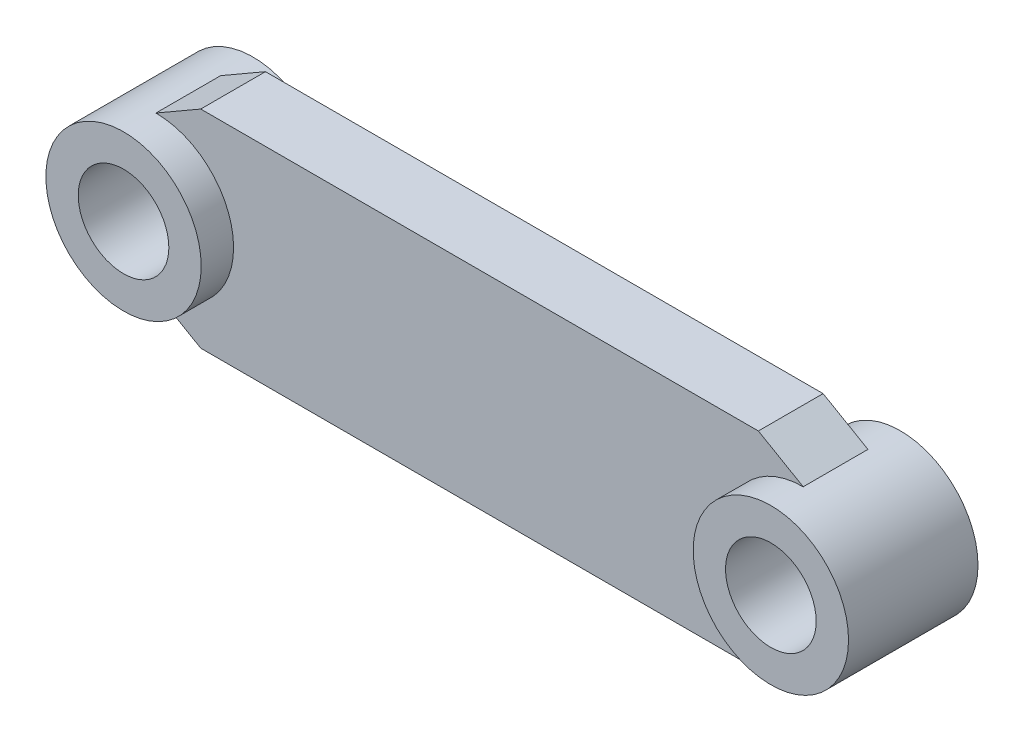
ISO-10303-21;
HEADER;
FILE_DESCRIPTION(('STEP AP214'),'2;1');
FILE_NAME('part.step','',(''),(''),'','','');
FILE_SCHEMA(('AUTOMOTIVE_DESIGN { 1 0 10303 214 1 1 1 1 }'));
ENDSEC;
DATA;
#1=APPLICATION_CONTEXT('core data for automotive mechanical design processes');
#2=APPLICATION_PROTOCOL_DEFINITION('international standard','automotive_design',2000,#1);
#3=PRODUCT_CONTEXT('',#1,'mechanical');
#4=PRODUCT('Part','Part','',(#3));
#5=PRODUCT_RELATED_PRODUCT_CATEGORY('part','',(#4));
#6=PRODUCT_DEFINITION_FORMATION('','',#4);
#7=PRODUCT_DEFINITION_CONTEXT('part definition',#1,'design');
#8=PRODUCT_DEFINITION('design','',#6,#7);
#9=PRODUCT_DEFINITION_SHAPE('','',#8);
#10=(LENGTH_UNIT() NAMED_UNIT(*) SI_UNIT(.MILLI.,.METRE.));
#11=(NAMED_UNIT(*) PLANE_ANGLE_UNIT() SI_UNIT($,.RADIAN.));
#12=(NAMED_UNIT(*) SI_UNIT($,.STERADIAN.) SOLID_ANGLE_UNIT());
#13=UNCERTAINTY_MEASURE_WITH_UNIT(LENGTH_MEASURE(1.E-05),#10,'distance_accuracy_value','');
#14=(GEOMETRIC_REPRESENTATION_CONTEXT(3) GLOBAL_UNCERTAINTY_ASSIGNED_CONTEXT((#13)) GLOBAL_UNIT_ASSIGNED_CONTEXT((#10,
#11,#12)) REPRESENTATION_CONTEXT('',''));
#15=CARTESIAN_POINT('',(0.,0.,0.));
#16=DIRECTION('',(0.,0.,1.));
#17=DIRECTION('',(1.,0.,0.));
#18=AXIS2_PLACEMENT_3D('',#15,#16,#17);
#19=CARTESIAN_POINT('',(0.,0.,2.5));
#20=DIRECTION('',(0.,0.,1.));
#21=DIRECTION('',(1.,0.,0.));
#22=AXIS2_PLACEMENT_3D('',#19,#20,#21);
#23=PLANE('',#22);
#24=DIRECTION('',(-0.866025403784443,-0.499999999999993,0.));
#25=VECTOR('',#24,1.);
#26=CARTESIAN_POINT('',(15.098076211353,-26.1506350946108,2.5));
#27=LINE('',#26,#25);
#28=CARTESIAN_POINT('',(50.,-6.,2.5));
#29=VERTEX_POINT('',#28);
#30=CARTESIAN_POINT('',(46.5358983848622,-8.,2.5));
#31=VERTEX_POINT('',#30);
#32=EDGE_CURVE('E149',#29,#31,#27,.T.);
#33=ORIENTED_EDGE('',*,*,#32,.F.);
#34=CARTESIAN_POINT('',(50.,0.,2.5));
#35=DIRECTION('',(0.,0.,1.));
#36=DIRECTION('',(1.,0.,0.));
#37=AXIS2_PLACEMENT_3D('',#34,#35,#36);
#38=CIRCLE('',#37,6.);
#39=CARTESIAN_POINT('',(50.,6.,2.5));
#40=VERTEX_POINT('',#39);
#41=EDGE_CURVE('E91',#29,#40,#38,.F.);
#42=ORIENTED_EDGE('',*,*,#41,.T.);
#43=DIRECTION('',(-0.866025403784443,0.499999999999993,0.));
#44=VECTOR('',#43,1.);
#45=CARTESIAN_POINT('',(15.098076211353,26.1506350946108,2.5));
#46=LINE('',#45,#44);
#47=CARTESIAN_POINT('',(46.5358983848622,8.,2.5));
#48=VERTEX_POINT('',#47);
#49=EDGE_CURVE('E179',#40,#48,#46,.T.);
#50=ORIENTED_EDGE('',*,*,#49,.T.);
#51=DIRECTION('',(-1.,0.,0.));
#52=VECTOR('',#51,1.);
#53=CARTESIAN_POINT('',(0.,7.99999999999999,2.5));
#54=LINE('',#53,#52);
#55=CARTESIAN_POINT('',(3.46410161513773,7.99999999999999,2.5));
#56=VERTEX_POINT('',#55);
#57=EDGE_CURVE('E131',#48,#56,#54,.T.);
#58=ORIENTED_EDGE('',*,*,#57,.T.);
#59=DIRECTION('',(0.866025403784438,0.500000000000002,0.));
#60=VECTOR('',#59,1.);
#61=CARTESIAN_POINT('',(-2.59807621135332,4.49999999999999,2.5));
#62=LINE('',#61,#60);
#63=CARTESIAN_POINT('',(0.,6.,2.5));
#64=VERTEX_POINT('',#63);
#65=EDGE_CURVE('E111',#64,#56,#62,.T.);
#66=ORIENTED_EDGE('',*,*,#65,.F.);
#67=CARTESIAN_POINT('',(0.,0.,2.5));
#68=DIRECTION('',(0.,0.,1.));
#69=DIRECTION('',(1.,0.,0.));
#70=AXIS2_PLACEMENT_3D('',#67,#68,#69);
#71=CIRCLE('',#70,6.);
#72=CARTESIAN_POINT('',(0.,-6.,2.5));
#73=VERTEX_POINT('',#72);
#74=EDGE_CURVE('E104',#64,#73,#71,.F.);
#75=ORIENTED_EDGE('',*,*,#74,.T.);
#76=DIRECTION('',(0.866025403784438,-0.500000000000002,0.));
#77=VECTOR('',#76,1.);
#78=CARTESIAN_POINT('',(-2.59807621135332,-4.49999999999999,2.5));
#79=LINE('',#78,#77);
#80=CARTESIAN_POINT('',(3.46410161513773,-7.99999999999999,2.5));
#81=VERTEX_POINT('',#80);
#82=EDGE_CURVE('E109',#73,#81,#79,.T.);
#83=ORIENTED_EDGE('',*,*,#82,.T.);
#84=DIRECTION('',(-1.,0.,0.));
#85=VECTOR('',#84,1.);
#86=CARTESIAN_POINT('',(0.,-7.99999999999999,2.5));
#87=LINE('',#86,#85);
#88=EDGE_CURVE('E128',#31,#81,#87,.T.);
#89=ORIENTED_EDGE('',*,*,#88,.F.);
#90=EDGE_LOOP('',(#33,#42,#50,#58,#66,#75,#83,#89));
#91=FACE_BOUND('',#90,.T.);
#92=ADVANCED_FACE('F39',(#91),#23,.T.);
#93=CARTESIAN_POINT('',(0.,0.,-2.5));
#94=DIRECTION('',(0.,0.,1.));
#95=DIRECTION('',(1.,0.,0.));
#96=AXIS2_PLACEMENT_3D('',#93,#94,#95);
#97=PLANE('',#96);
#98=CARTESIAN_POINT('',(50.,0.,-2.5));
#99=DIRECTION('',(0.,0.,1.));
#100=DIRECTION('',(1.,0.,0.));
#101=AXIS2_PLACEMENT_3D('',#98,#99,#100);
#102=CIRCLE('',#101,6.);
#103=CARTESIAN_POINT('',(50.,-6.,-2.5));
#104=VERTEX_POINT('',#103);
#105=CARTESIAN_POINT('',(50.,6.,-2.5));
#106=VERTEX_POINT('',#105);
#107=EDGE_CURVE('E11',#104,#106,#102,.F.);
#108=ORIENTED_EDGE('',*,*,#107,.F.);
#109=DIRECTION('',(-0.866025403784443,-0.499999999999993,0.));
#110=VECTOR('',#109,1.);
#111=CARTESIAN_POINT('',(15.098076211353,-26.1506350946108,-2.5));
#112=LINE('',#111,#110);
#113=CARTESIAN_POINT('',(46.5358983848622,-8.,-2.5));
#114=VERTEX_POINT('',#113);
#115=EDGE_CURVE('E115',#104,#114,#112,.T.);
#116=ORIENTED_EDGE('',*,*,#115,.T.);
#117=DIRECTION('',(-1.,0.,0.));
#118=VECTOR('',#117,1.);
#119=CARTESIAN_POINT('',(0.,-7.99999999999999,-2.5));
#120=LINE('',#119,#118);
#121=CARTESIAN_POINT('',(3.46410161513773,-7.99999999999999,-2.5));
#122=VERTEX_POINT('',#121);
#123=EDGE_CURVE('E146',#114,#122,#120,.T.);
#124=ORIENTED_EDGE('',*,*,#123,.T.);
#125=DIRECTION('',(0.866025403784438,-0.500000000000002,0.));
#126=VECTOR('',#125,1.);
#127=CARTESIAN_POINT('',(-2.59807621135332,-4.49999999999999,-2.5));
#128=LINE('',#127,#126);
#129=CARTESIAN_POINT('',(0.,-6.,-2.5));
#130=VERTEX_POINT('',#129);
#131=EDGE_CURVE('E144',#130,#122,#128,.T.);
#132=ORIENTED_EDGE('',*,*,#131,.F.);
#133=CARTESIAN_POINT('',(0.,0.,-2.5));
#134=DIRECTION('',(0.,0.,1.));
#135=DIRECTION('',(1.,0.,0.));
#136=AXIS2_PLACEMENT_3D('',#133,#134,#135);
#137=CIRCLE('',#136,6.);
#138=CARTESIAN_POINT('',(0.,6.,-2.5));
#139=VERTEX_POINT('',#138);
#140=EDGE_CURVE('E48',#139,#130,#137,.F.);
#141=ORIENTED_EDGE('',*,*,#140,.F.);
#142=DIRECTION('',(0.866025403784438,0.500000000000002,0.));
#143=VECTOR('',#142,1.);
#144=CARTESIAN_POINT('',(-2.59807621135332,4.49999999999999,-2.5));
#145=LINE('',#144,#143);
#146=CARTESIAN_POINT('',(3.46410161513773,7.99999999999999,-2.5));
#147=VERTEX_POINT('',#146);
#148=EDGE_CURVE('E141',#139,#147,#145,.T.);
#149=ORIENTED_EDGE('',*,*,#148,.T.);
#150=DIRECTION('',(-1.,0.,0.));
#151=VECTOR('',#150,1.);
#152=CARTESIAN_POINT('',(0.,7.99999999999999,-2.5));
#153=LINE('',#152,#151);
#154=CARTESIAN_POINT('',(46.5358983848622,8.,-2.5));
#155=VERTEX_POINT('',#154);
#156=EDGE_CURVE('E138',#155,#147,#153,.T.);
#157=ORIENTED_EDGE('',*,*,#156,.F.);
#158=DIRECTION('',(-0.866025403784443,0.499999999999993,0.));
#159=VECTOR('',#158,1.);
#160=CARTESIAN_POINT('',(15.098076211353,26.1506350946108,-2.5));
#161=LINE('',#160,#159);
#162=EDGE_CURVE('E136',#106,#155,#161,.T.);
#163=ORIENTED_EDGE('',*,*,#162,.F.);
#164=EDGE_LOOP('',(#108,#116,#124,#132,#141,#149,#157,#163));
#165=FACE_BOUND('',#164,.T.);
#166=ADVANCED_FACE('F169',(#165),#97,.F.);
#167=CARTESIAN_POINT('',(15.098076211353,-26.1506350946108,2.5));
#168=DIRECTION('',(0.499999999999993,-0.866025403784442,0.));
#169=DIRECTION('',(0.866025403784442,0.499999999999993,0.));
#170=AXIS2_PLACEMENT_3D('',#167,#168,#169);
#171=PLANE('',#170);
#172=ORIENTED_EDGE('',*,*,#115,.F.);
#173=DIRECTION('',(0.,0.,-1.));
#174=VECTOR('',#173,1.);
#175=CARTESIAN_POINT('',(50.,-6.,2.5));
#176=LINE('',#175,#174);
#177=EDGE_CURVE('E160',#29,#104,#176,.T.);
#178=ORIENTED_EDGE('',*,*,#177,.F.);
#179=ORIENTED_EDGE('',*,*,#32,.T.);
#180=DIRECTION('',(0.,0.,-1.));
#181=VECTOR('',#180,1.);
#182=CARTESIAN_POINT('',(46.5358983848622,-8.,2.5));
#183=LINE('',#182,#181);
#184=EDGE_CURVE('E56',#31,#114,#183,.T.);
#185=ORIENTED_EDGE('',*,*,#184,.T.);
#186=EDGE_LOOP('',(#172,#178,#179,#185));
#187=FACE_BOUND('',#186,.T.);
#188=ADVANCED_FACE('F41',(#187),#171,.T.);
#189=CARTESIAN_POINT('',(50.,0.,2.5));
#190=DIRECTION('',(0.,0.,-1.));
#191=DIRECTION('',(-1.,0.,0.));
#192=AXIS2_PLACEMENT_3D('',#189,#190,#191);
#193=CYLINDRICAL_SURFACE('',#192,6.);
#194=ORIENTED_EDGE('',*,*,#177,.T.);
#195=ORIENTED_EDGE('',*,*,#107,.T.);
#196=DIRECTION('',(0.,0.,-1.));
#197=VECTOR('',#196,1.);
#198=CARTESIAN_POINT('',(50.,6.,2.5));
#199=LINE('',#198,#197);
#200=EDGE_CURVE('E158',#40,#106,#199,.T.);
#201=ORIENTED_EDGE('',*,*,#200,.F.);
#202=ORIENTED_EDGE('',*,*,#41,.F.);
#203=EDGE_LOOP('',(#194,#195,#201,#202));
#204=FACE_BOUND('',#203,.T.);
#205=CARTESIAN_POINT('',(50.,0.,-5.));
#206=DIRECTION('',(0.,0.,1.));
#207=DIRECTION('',(1.,0.,0.));
#208=AXIS2_PLACEMENT_3D('',#205,#206,#207);
#209=CIRCLE('',#208,6.);
#210=CARTESIAN_POINT('',(56.,0.,-5.));
#211=VERTEX_POINT('',#210);
#212=EDGE_CURVE('E196',#211,#211,#209,.T.);
#213=ORIENTED_EDGE('',*,*,#212,.T.);
#214=EDGE_LOOP('',(#213));
#215=FACE_BOUND('',#214,.T.);
#216=CARTESIAN_POINT('',(50.,0.,5.));
#217=DIRECTION('',(0.,0.,1.));
#218=DIRECTION('',(1.,0.,0.));
#219=AXIS2_PLACEMENT_3D('',#216,#217,#218);
#220=CIRCLE('',#219,6.);
#221=CARTESIAN_POINT('',(56.,0.,5.));
#222=VERTEX_POINT('',#221);
#223=EDGE_CURVE('E195',#222,#222,#220,.T.);
#224=ORIENTED_EDGE('',*,*,#223,.F.);
#225=EDGE_LOOP('',(#224));
#226=FACE_BOUND('',#225,.T.);
#227=ADVANCED_FACE('F163',(#204,#215,#226),#193,.T.);
#228=CARTESIAN_POINT('',(15.098076211353,26.1506350946108,2.5));
#229=DIRECTION('',(-0.499999999999993,-0.866025403784442,0.));
#230=DIRECTION('',(0.866025403784442,-0.499999999999993,0.));
#231=AXIS2_PLACEMENT_3D('',#228,#229,#230);
#232=PLANE('',#231);
#233=ORIENTED_EDGE('',*,*,#162,.T.);
#234=DIRECTION('',(0.,0.,-1.));
#235=VECTOR('',#234,1.);
#236=CARTESIAN_POINT('',(46.5358983848622,8.,2.5));
#237=LINE('',#236,#235);
#238=EDGE_CURVE('E155',#48,#155,#237,.T.);
#239=ORIENTED_EDGE('',*,*,#238,.F.);
#240=ORIENTED_EDGE('',*,*,#49,.F.);
#241=ORIENTED_EDGE('',*,*,#200,.T.);
#242=EDGE_LOOP('',(#233,#239,#240,#241));
#243=FACE_BOUND('',#242,.T.);
#244=ADVANCED_FACE('F173',(#243),#232,.F.);
#245=CARTESIAN_POINT('',(0.,7.99999999999999,2.5));
#246=DIRECTION('',(0.,-1.,0.));
#247=DIRECTION('',(1.,0.,0.));
#248=AXIS2_PLACEMENT_3D('',#245,#246,#247);
#249=PLANE('',#248);
#250=ORIENTED_EDGE('',*,*,#156,.T.);
#251=DIRECTION('',(0.,0.,-1.));
#252=VECTOR('',#251,1.);
#253=CARTESIAN_POINT('',(3.46410161513773,7.99999999999999,2.5));
#254=LINE('',#253,#252);
#255=EDGE_CURVE('E153',#56,#147,#254,.T.);
#256=ORIENTED_EDGE('',*,*,#255,.F.);
#257=ORIENTED_EDGE('',*,*,#57,.F.);
#258=ORIENTED_EDGE('',*,*,#238,.T.);
#259=EDGE_LOOP('',(#250,#256,#257,#258));
#260=FACE_BOUND('',#259,.T.);
#261=ADVANCED_FACE('F177',(#260),#249,.F.);
#262=CARTESIAN_POINT('',(-2.59807621135332,4.49999999999999,2.5));
#263=DIRECTION('',(-0.500000000000002,0.866025403784438,0.));
#264=DIRECTION('',(-0.866025403784438,-0.500000000000002,0.));
#265=AXIS2_PLACEMENT_3D('',#262,#263,#264);
#266=PLANE('',#265);
#267=ORIENTED_EDGE('',*,*,#148,.F.);
#268=DIRECTION('',(0.,0.,-1.));
#269=VECTOR('',#268,1.);
#270=CARTESIAN_POINT('',(0.,6.,2.5));
#271=LINE('',#270,#269);
#272=EDGE_CURVE('E125',#64,#139,#271,.T.);
#273=ORIENTED_EDGE('',*,*,#272,.F.);
#274=ORIENTED_EDGE('',*,*,#65,.T.);
#275=ORIENTED_EDGE('',*,*,#255,.T.);
#276=EDGE_LOOP('',(#267,#273,#274,#275));
#277=FACE_BOUND('',#276,.T.);
#278=ADVANCED_FACE('F248',(#277),#266,.T.);
#279=CARTESIAN_POINT('',(0.,0.,2.5));
#280=DIRECTION('',(0.,0.,-1.));
#281=DIRECTION('',(-1.,0.,0.));
#282=AXIS2_PLACEMENT_3D('',#279,#280,#281);
#283=CYLINDRICAL_SURFACE('',#282,6.);
#284=ORIENTED_EDGE('',*,*,#272,.T.);
#285=ORIENTED_EDGE('',*,*,#140,.T.);
#286=DIRECTION('',(0.,0.,-1.));
#287=VECTOR('',#286,1.);
#288=CARTESIAN_POINT('',(0.,-6.,2.5));
#289=LINE('',#288,#287);
#290=EDGE_CURVE('E120',#73,#130,#289,.T.);
#291=ORIENTED_EDGE('',*,*,#290,.F.);
#292=ORIENTED_EDGE('',*,*,#74,.F.);
#293=EDGE_LOOP('',(#284,#285,#291,#292));
#294=FACE_BOUND('',#293,.T.);
#295=CARTESIAN_POINT('',(0.,0.,-5.));
#296=DIRECTION('',(0.,0.,1.));
#297=DIRECTION('',(1.,0.,0.));
#298=AXIS2_PLACEMENT_3D('',#295,#296,#297);
#299=CIRCLE('',#298,6.);
#300=CARTESIAN_POINT('',(6.,0.,-5.));
#301=VERTEX_POINT('',#300);
#302=EDGE_CURVE('E183',#301,#301,#299,.T.);
#303=ORIENTED_EDGE('',*,*,#302,.T.);
#304=EDGE_LOOP('',(#303));
#305=FACE_BOUND('',#304,.T.);
#306=CARTESIAN_POINT('',(0.,0.,5.));
#307=DIRECTION('',(0.,0.,1.));
#308=DIRECTION('',(1.,0.,0.));
#309=AXIS2_PLACEMENT_3D('',#306,#307,#308);
#310=CIRCLE('',#309,6.);
#311=CARTESIAN_POINT('',(6.,0.,5.));
#312=VERTEX_POINT('',#311);
#313=EDGE_CURVE('E116',#312,#312,#310,.T.);
#314=ORIENTED_EDGE('',*,*,#313,.F.);
#315=EDGE_LOOP('',(#314));
#316=FACE_BOUND('',#315,.T.);
#317=ADVANCED_FACE('F121',(#294,#305,#316),#283,.T.);
#318=CARTESIAN_POINT('',(-2.59807621135332,-4.49999999999999,2.5));
#319=DIRECTION('',(0.500000000000002,0.866025403784438,0.));
#320=DIRECTION('',(-0.866025403784438,0.500000000000002,0.));
#321=AXIS2_PLACEMENT_3D('',#318,#319,#320);
#322=PLANE('',#321);
#323=ORIENTED_EDGE('',*,*,#131,.T.);
#324=DIRECTION('',(0.,0.,-1.));
#325=VECTOR('',#324,1.);
#326=CARTESIAN_POINT('',(3.46410161513773,-7.99999999999999,2.5));
#327=LINE('',#326,#325);
#328=EDGE_CURVE('E78',#81,#122,#327,.T.);
#329=ORIENTED_EDGE('',*,*,#328,.F.);
#330=ORIENTED_EDGE('',*,*,#82,.F.);
#331=ORIENTED_EDGE('',*,*,#290,.T.);
#332=EDGE_LOOP('',(#323,#329,#330,#331));
#333=FACE_BOUND('',#332,.T.);
#334=ADVANCED_FACE('F127',(#333),#322,.F.);
#335=CARTESIAN_POINT('',(0.,-7.99999999999999,2.5));
#336=DIRECTION('',(0.,-1.,0.));
#337=DIRECTION('',(1.,0.,0.));
#338=AXIS2_PLACEMENT_3D('',#335,#336,#337);
#339=PLANE('',#338);
#340=ORIENTED_EDGE('',*,*,#123,.F.);
#341=ORIENTED_EDGE('',*,*,#184,.F.);
#342=ORIENTED_EDGE('',*,*,#88,.T.);
#343=ORIENTED_EDGE('',*,*,#328,.T.);
#344=EDGE_LOOP('',(#340,#341,#342,#343));
#345=FACE_BOUND('',#344,.T.);
#346=ADVANCED_FACE('F241',(#345),#339,.T.);
#347=CARTESIAN_POINT('',(0.,0.,-5.));
#348=DIRECTION('',(0.,0.,1.));
#349=DIRECTION('',(1.,0.,0.));
#350=AXIS2_PLACEMENT_3D('',#347,#348,#349);
#351=PLANE('',#350);
#352=CARTESIAN_POINT('',(0.,0.,-5.));
#353=DIRECTION('',(0.,0.,1.));
#354=DIRECTION('',(1.,0.,0.));
#355=AXIS2_PLACEMENT_3D('',#352,#353,#354);
#356=CIRCLE('',#355,3.5);
#357=CARTESIAN_POINT('',(3.5,0.,-5.));
#358=VERTEX_POINT('',#357);
#359=EDGE_CURVE('E187',#358,#358,#356,.T.);
#360=ORIENTED_EDGE('',*,*,#359,.T.);
#361=EDGE_LOOP('',(#360));
#362=FACE_BOUND('',#361,.T.);
#363=ORIENTED_EDGE('',*,*,#302,.F.);
#364=EDGE_LOOP('',(#363));
#365=FACE_BOUND('',#364,.T.);
#366=ADVANCED_FACE('F229',(#362,#365),#351,.F.);
#367=CARTESIAN_POINT('',(0.,0.,2.5));
#368=DIRECTION('',(0.,0.,-1.));
#369=DIRECTION('',(-1.,0.,0.));
#370=AXIS2_PLACEMENT_3D('',#367,#368,#369);
#371=CYLINDRICAL_SURFACE('',#370,3.5);
#372=ORIENTED_EDGE('',*,*,#359,.F.);
#373=EDGE_LOOP('',(#372));
#374=FACE_BOUND('',#373,.T.);
#375=CARTESIAN_POINT('',(0.,0.,5.));
#376=DIRECTION('',(0.,0.,1.));
#377=DIRECTION('',(1.,0.,0.));
#378=AXIS2_PLACEMENT_3D('',#375,#376,#377);
#379=CIRCLE('',#378,3.5);
#380=CARTESIAN_POINT('',(3.5,0.,5.));
#381=VERTEX_POINT('',#380);
#382=EDGE_CURVE('E186',#381,#381,#379,.T.);
#383=ORIENTED_EDGE('',*,*,#382,.T.);
#384=EDGE_LOOP('',(#383));
#385=FACE_BOUND('',#384,.T.);
#386=ADVANCED_FACE('F236',(#374,#385),#371,.F.);
#387=CARTESIAN_POINT('',(0.,0.,5.));
#388=DIRECTION('',(0.,0.,1.));
#389=DIRECTION('',(1.,0.,0.));
#390=AXIS2_PLACEMENT_3D('',#387,#388,#389);
#391=PLANE('',#390);
#392=ORIENTED_EDGE('',*,*,#382,.F.);
#393=EDGE_LOOP('',(#392));
#394=FACE_BOUND('',#393,.T.);
#395=ORIENTED_EDGE('',*,*,#313,.T.);
#396=EDGE_LOOP('',(#395));
#397=FACE_BOUND('',#396,.T.);
#398=ADVANCED_FACE('F239',(#394,#397),#391,.T.);
#399=CARTESIAN_POINT('',(0.,0.,-5.));
#400=DIRECTION('',(0.,0.,1.));
#401=DIRECTION('',(1.,0.,0.));
#402=AXIS2_PLACEMENT_3D('',#399,#400,#401);
#403=PLANE('',#402);
#404=CARTESIAN_POINT('',(50.,0.,-5.));
#405=DIRECTION('',(0.,0.,1.));
#406=DIRECTION('',(1.,0.,0.));
#407=AXIS2_PLACEMENT_3D('',#404,#405,#406);
#408=CIRCLE('',#407,3.5);
#409=CARTESIAN_POINT('',(53.5,0.,-5.));
#410=VERTEX_POINT('',#409);
#411=EDGE_CURVE('E200',#410,#410,#408,.T.);
#412=ORIENTED_EDGE('',*,*,#411,.T.);
#413=EDGE_LOOP('',(#412));
#414=FACE_BOUND('',#413,.T.);
#415=ORIENTED_EDGE('',*,*,#212,.F.);
#416=EDGE_LOOP('',(#415));
#417=FACE_BOUND('',#416,.T.);
#418=ADVANCED_FACE('F234',(#414,#417),#403,.F.);
#419=CARTESIAN_POINT('',(50.,0.,2.5));
#420=DIRECTION('',(0.,0.,-1.));
#421=DIRECTION('',(-1.,0.,0.));
#422=AXIS2_PLACEMENT_3D('',#419,#420,#421);
#423=CYLINDRICAL_SURFACE('',#422,3.5);
#424=ORIENTED_EDGE('',*,*,#411,.F.);
#425=EDGE_LOOP('',(#424));
#426=FACE_BOUND('',#425,.T.);
#427=CARTESIAN_POINT('',(50.,0.,5.));
#428=DIRECTION('',(0.,0.,1.));
#429=DIRECTION('',(1.,0.,0.));
#430=AXIS2_PLACEMENT_3D('',#427,#428,#429);
#431=CIRCLE('',#430,3.5);
#432=CARTESIAN_POINT('',(53.5,0.,5.));
#433=VERTEX_POINT('',#432);
#434=EDGE_CURVE('E199',#433,#433,#431,.T.);
#435=ORIENTED_EDGE('',*,*,#434,.T.);
#436=EDGE_LOOP('',(#435));
#437=FACE_BOUND('',#436,.T.);
#438=ADVANCED_FACE('F208',(#426,#437),#423,.F.);
#439=CARTESIAN_POINT('',(0.,0.,5.));
#440=DIRECTION('',(0.,0.,1.));
#441=DIRECTION('',(1.,0.,0.));
#442=AXIS2_PLACEMENT_3D('',#439,#440,#441);
#443=PLANE('',#442);
#444=ORIENTED_EDGE('',*,*,#434,.F.);
#445=EDGE_LOOP('',(#444));
#446=FACE_BOUND('',#445,.T.);
#447=ORIENTED_EDGE('',*,*,#223,.T.);
#448=EDGE_LOOP('',(#447));
#449=FACE_BOUND('',#448,.T.);
#450=ADVANCED_FACE('F210',(#446,#449),#443,.T.);
#451=CLOSED_SHELL('',(#92,#166,#188,#227,#244,#261,#278,#317,#334,#346,#366,#386,#398,#418,#438,#450));
#452=MANIFOLD_SOLID_BREP('B2',#451);
#453=ADVANCED_BREP_SHAPE_REPRESENTATION('',(#18,#452),#14);
#454=SHAPE_DEFINITION_REPRESENTATION(#9,#453);
ENDSEC;
END-ISO-10303-21;
